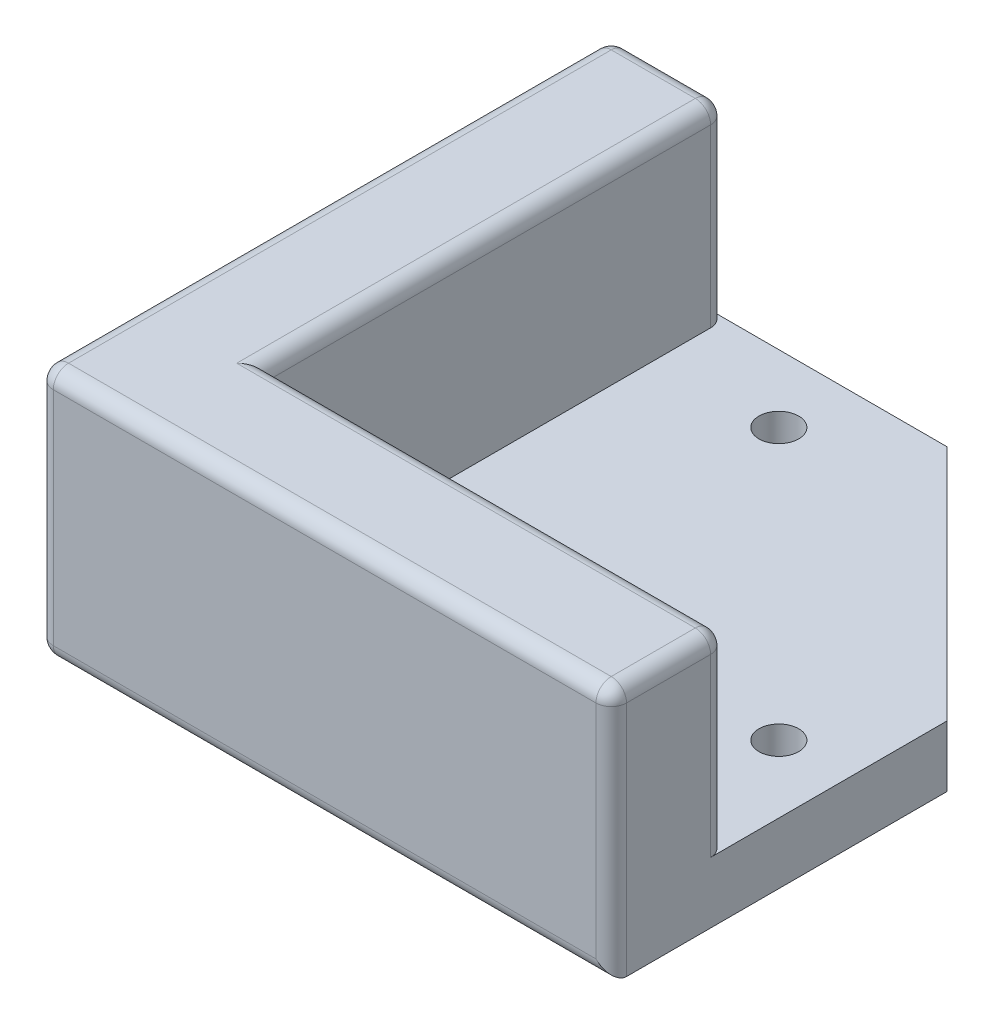
ISO-10303-21;
HEADER;
FILE_DESCRIPTION(('STEP AP214'),'2;1');
FILE_NAME('part.step','',(''),(''),'','','');
FILE_SCHEMA(('AUTOMOTIVE_DESIGN { 1 0 10303 214 1 1 1 1 }'));
ENDSEC;
DATA;
#1=APPLICATION_CONTEXT('core data for automotive mechanical design processes');
#2=APPLICATION_PROTOCOL_DEFINITION('international standard','automotive_design',2000,#1);
#3=PRODUCT_CONTEXT('',#1,'mechanical');
#4=PRODUCT('Part','Part','',(#3));
#5=PRODUCT_RELATED_PRODUCT_CATEGORY('part','',(#4));
#6=PRODUCT_DEFINITION_FORMATION('','',#4);
#7=PRODUCT_DEFINITION_CONTEXT('part definition',#1,'design');
#8=PRODUCT_DEFINITION('design','',#6,#7);
#9=PRODUCT_DEFINITION_SHAPE('','',#8);
#10=(LENGTH_UNIT() NAMED_UNIT(*) SI_UNIT(.MILLI.,.METRE.));
#11=(NAMED_UNIT(*) PLANE_ANGLE_UNIT() SI_UNIT($,.RADIAN.));
#12=(NAMED_UNIT(*) SI_UNIT($,.STERADIAN.) SOLID_ANGLE_UNIT());
#13=UNCERTAINTY_MEASURE_WITH_UNIT(LENGTH_MEASURE(1.E-05),#10,'distance_accuracy_value','');
#14=(GEOMETRIC_REPRESENTATION_CONTEXT(3) GLOBAL_UNCERTAINTY_ASSIGNED_CONTEXT((#13)) GLOBAL_UNIT_ASSIGNED_CONTEXT((#10,
#11,#12)) REPRESENTATION_CONTEXT('',''));
#15=CARTESIAN_POINT('',(0.,0.,0.));
#16=DIRECTION('',(0.,0.,1.));
#17=DIRECTION('',(1.,0.,0.));
#18=AXIS2_PLACEMENT_3D('',#15,#16,#17);
#19=CARTESIAN_POINT('',(38.1,2.54,0.));
#20=DIRECTION('',(-1.,0.,0.));
#21=DIRECTION('',(0.,0.,1.));
#22=AXIS2_PLACEMENT_3D('',#19,#20,#21);
#23=PLANE('',#22);
#24=DIRECTION('',(0.,0.,-1.));
#25=VECTOR('',#24,1.);
#26=CARTESIAN_POINT('',(38.1,1.27,9.525));
#27=LINE('',#26,#25);
#28=CARTESIAN_POINT('',(38.1,1.27,1.27));
#29=VERTEX_POINT('',#28);
#30=CARTESIAN_POINT('',(38.1,1.27,8.255));
#31=VERTEX_POINT('',#30);
#32=EDGE_CURVE('E240',#29,#31,#27,.F.);
#33=ORIENTED_EDGE('',*,*,#32,.T.);
#34=DIRECTION('',(0.,1.,0.));
#35=VECTOR('',#34,1.);
#36=CARTESIAN_POINT('',(38.1,2.54,8.255));
#37=LINE('',#36,#35);
#38=CARTESIAN_POINT('',(38.1,-18.415,8.255));
#39=VERTEX_POINT('',#38);
#40=EDGE_CURVE('E244',#31,#39,#37,.F.);
#41=ORIENTED_EDGE('',*,*,#40,.T.);
#42=DIRECTION('',(0.,0.,1.));
#43=VECTOR('',#42,1.);
#44=CARTESIAN_POINT('',(38.1,-18.415,9.52500000000001));
#45=LINE('',#44,#43);
#46=CARTESIAN_POINT('',(38.1,-18.415,-18.3730790919814));
#47=VERTEX_POINT('',#46);
#48=EDGE_CURVE('E192',#47,#39,#45,.T.);
#49=ORIENTED_EDGE('',*,*,#48,.F.);
#50=DIRECTION('',(0.,1.,0.));
#51=VECTOR('',#50,1.);
#52=CARTESIAN_POINT('',(38.1,-18.415,-18.3730790919814));
#53=LINE('',#52,#51);
#54=CARTESIAN_POINT('',(38.1,-13.335,-18.3730790919814));
#55=VERTEX_POINT('',#54);
#56=EDGE_CURVE('E186',#47,#55,#53,.T.);
#57=ORIENTED_EDGE('',*,*,#56,.T.);
#58=DIRECTION('',(0.,0.,1.));
#59=VECTOR('',#58,1.);
#60=CARTESIAN_POINT('',(38.1,-13.335,9.52500000000001));
#61=LINE('',#60,#59);
#62=CARTESIAN_POINT('',(38.1,-13.335,1.27));
#63=VERTEX_POINT('',#62);
#64=EDGE_CURVE('E175',#55,#63,#61,.T.);
#65=ORIENTED_EDGE('',*,*,#64,.T.);
#66=DIRECTION('',(0.,1.,0.));
#67=VECTOR('',#66,1.);
#68=CARTESIAN_POINT('',(38.1,2.54,1.27));
#69=LINE('',#68,#67);
#70=EDGE_CURVE('E237',#63,#29,#69,.T.);
#71=ORIENTED_EDGE('',*,*,#70,.T.);
#72=EDGE_LOOP('',(#33,#41,#49,#57,#65,#71));
#73=FACE_BOUND('',#72,.T.);
#74=ADVANCED_FACE('F45',(#73),#23,.F.);
#75=CARTESIAN_POINT('',(2.38125,2.54,-38.1));
#76=DIRECTION('',(0.,0.,1.));
#77=DIRECTION('',(1.,0.,0.));
#78=AXIS2_PLACEMENT_3D('',#75,#76,#77);
#79=PLANE('',#78);
#80=DIRECTION('',(1.,0.,0.));
#81=VECTOR('',#80,1.);
#82=CARTESIAN_POINT('',(-9.52499999999999,-18.415,-38.1));
#83=LINE('',#82,#81);
#84=CARTESIAN_POINT('',(-8.255,-18.415,-38.1));
#85=VERTEX_POINT('',#84);
#86=CARTESIAN_POINT('',(18.3730790919813,-18.415,-38.1));
#87=VERTEX_POINT('',#86);
#88=EDGE_CURVE('E163',#85,#87,#83,.T.);
#89=ORIENTED_EDGE('',*,*,#88,.F.);
#90=DIRECTION('',(0.,1.,0.));
#91=VECTOR('',#90,1.);
#92=CARTESIAN_POINT('',(-8.255,2.54,-38.1));
#93=LINE('',#92,#91);
#94=CARTESIAN_POINT('',(-8.255,1.27,-38.1));
#95=VERTEX_POINT('',#94);
#96=EDGE_CURVE('E253',#85,#95,#93,.T.);
#97=ORIENTED_EDGE('',*,*,#96,.T.);
#98=DIRECTION('',(-1.,0.,0.));
#99=VECTOR('',#98,1.);
#100=CARTESIAN_POINT('',(0.,1.27,-38.1));
#101=LINE('',#100,#99);
#102=CARTESIAN_POINT('',(-1.27,1.27,-38.1));
#103=VERTEX_POINT('',#102);
#104=EDGE_CURVE('E250',#95,#103,#101,.F.);
#105=ORIENTED_EDGE('',*,*,#104,.T.);
#106=DIRECTION('',(0.,1.,0.));
#107=VECTOR('',#106,1.);
#108=CARTESIAN_POINT('',(-1.27,2.54,-38.1));
#109=LINE('',#108,#107);
#110=CARTESIAN_POINT('',(-1.27,-13.335,-38.1));
#111=VERTEX_POINT('',#110);
#112=EDGE_CURVE('E247',#103,#111,#109,.F.);
#113=ORIENTED_EDGE('',*,*,#112,.T.);
#114=DIRECTION('',(1.,0.,0.));
#115=VECTOR('',#114,1.);
#116=CARTESIAN_POINT('',(-9.52499999999999,-13.335,-38.1));
#117=LINE('',#116,#115);
#118=CARTESIAN_POINT('',(18.3730790919813,-13.335,-38.1));
#119=VERTEX_POINT('',#118);
#120=EDGE_CURVE('E181',#111,#119,#117,.T.);
#121=ORIENTED_EDGE('',*,*,#120,.T.);
#122=DIRECTION('',(0.,1.,0.));
#123=VECTOR('',#122,1.);
#124=CARTESIAN_POINT('',(18.3730790919813,-18.415,-38.1));
#125=LINE('',#124,#123);
#126=EDGE_CURVE('E178',#87,#119,#125,.T.);
#127=ORIENTED_EDGE('',*,*,#126,.F.);
#128=EDGE_LOOP('',(#89,#97,#105,#113,#121,#127));
#129=FACE_BOUND('',#128,.T.);
#130=ADVANCED_FACE('F179',(#129),#79,.F.);
#131=CARTESIAN_POINT('',(0.,2.54,0.));
#132=DIRECTION('',(0.,1.,0.));
#133=DIRECTION('',(0.,0.,1.));
#134=AXIS2_PLACEMENT_3D('',#131,#132,#133);
#135=PLANE('',#134);
#136=DIRECTION('',(1.,0.,0.));
#137=VECTOR('',#136,1.);
#138=CARTESIAN_POINT('',(0.,2.54,1.27));
#139=LINE('',#138,#137);
#140=CARTESIAN_POINT('',(36.83,2.54,1.27));
#141=VERTEX_POINT('',#140);
#142=CARTESIAN_POINT('',(-1.27,2.54,1.27));
#143=VERTEX_POINT('',#142);
#144=EDGE_CURVE('E231',#141,#143,#139,.F.);
#145=ORIENTED_EDGE('',*,*,#144,.T.);
#146=DIRECTION('',(0.,0.,1.));
#147=VECTOR('',#146,1.);
#148=CARTESIAN_POINT('',(-1.27,2.54,-38.1));
#149=LINE('',#148,#147);
#150=CARTESIAN_POINT('',(-1.27,2.54,-36.83));
#151=VERTEX_POINT('',#150);
#152=EDGE_CURVE('E234',#143,#151,#149,.F.);
#153=ORIENTED_EDGE('',*,*,#152,.T.);
#154=DIRECTION('',(-1.,0.,0.));
#155=VECTOR('',#154,1.);
#156=CARTESIAN_POINT('',(-9.525,2.54,-36.83));
#157=LINE('',#156,#155);
#158=CARTESIAN_POINT('',(-8.255,2.54,-36.83));
#159=VERTEX_POINT('',#158);
#160=EDGE_CURVE('E224',#151,#159,#157,.T.);
#161=ORIENTED_EDGE('',*,*,#160,.T.);
#162=DIRECTION('',(0.,0.,1.));
#163=VECTOR('',#162,1.);
#164=CARTESIAN_POINT('',(-8.255,2.54,0.));
#165=LINE('',#164,#163);
#166=CARTESIAN_POINT('',(-8.25499999999999,2.54,8.255));
#167=VERTEX_POINT('',#166);
#168=EDGE_CURVE('E218',#159,#167,#165,.T.);
#169=ORIENTED_EDGE('',*,*,#168,.T.);
#170=DIRECTION('',(-1.,0.,0.));
#171=VECTOR('',#170,1.);
#172=CARTESIAN_POINT('',(38.1,2.54,8.255));
#173=LINE('',#172,#171);
#174=CARTESIAN_POINT('',(36.83,2.54,8.255));
#175=VERTEX_POINT('',#174);
#176=EDGE_CURVE('E221',#167,#175,#173,.F.);
#177=ORIENTED_EDGE('',*,*,#176,.T.);
#178=DIRECTION('',(0.,0.,-1.));
#179=VECTOR('',#178,1.);
#180=CARTESIAN_POINT('',(36.83,2.54,0.));
#181=LINE('',#180,#179);
#182=EDGE_CURVE('E227',#175,#141,#181,.T.);
#183=ORIENTED_EDGE('',*,*,#182,.T.);
#184=EDGE_LOOP('',(#145,#153,#161,#169,#177,#183));
#185=FACE_BOUND('',#184,.T.);
#186=ADVANCED_FACE('F418',(#185),#135,.T.);
#187=CARTESIAN_POINT('',(0.,-13.335,0.));
#188=DIRECTION('',(-1.,0.,0.));
#189=DIRECTION('',(0.,0.,1.));
#190=AXIS2_PLACEMENT_3D('',#187,#188,#189);
#191=PLANE('',#190);
#192=DIRECTION('',(0.,1.,0.));
#193=VECTOR('',#192,1.);
#194=CARTESIAN_POINT('',(0.,-13.335,-36.83));
#195=LINE('',#194,#193);
#196=CARTESIAN_POINT('',(0.,-13.335,-36.83));
#197=VERTEX_POINT('',#196);
#198=CARTESIAN_POINT('',(0.,1.27,-36.83));
#199=VERTEX_POINT('',#198);
#200=EDGE_CURVE('E256',#197,#199,#195,.T.);
#201=ORIENTED_EDGE('',*,*,#200,.T.);
#202=DIRECTION('',(0.,0.,1.));
#203=VECTOR('',#202,1.);
#204=CARTESIAN_POINT('',(0.,1.27,0.));
#205=LINE('',#204,#203);
#206=CARTESIAN_POINT('',(0.,1.27,0.));
#207=VERTEX_POINT('',#206);
#208=EDGE_CURVE('E259',#199,#207,#205,.T.);
#209=ORIENTED_EDGE('',*,*,#208,.T.);
#210=DIRECTION('',(0.,1.,0.));
#211=VECTOR('',#210,1.);
#212=CARTESIAN_POINT('',(0.,-13.335,0.));
#213=LINE('',#212,#211);
#214=CARTESIAN_POINT('',(0.,-13.335,0.));
#215=VERTEX_POINT('',#214);
#216=EDGE_CURVE('E214',#215,#207,#213,.T.);
#217=ORIENTED_EDGE('',*,*,#216,.F.);
#218=DIRECTION('',(0.,0.,1.));
#219=VECTOR('',#218,1.);
#220=CARTESIAN_POINT('',(0.,-13.335,0.));
#221=LINE('',#220,#219);
#222=EDGE_CURVE('E210',#197,#215,#221,.T.);
#223=ORIENTED_EDGE('',*,*,#222,.F.);
#224=EDGE_LOOP('',(#201,#209,#217,#223));
#225=FACE_BOUND('',#224,.T.);
#226=ADVANCED_FACE('F509',(#225),#191,.F.);
#227=CARTESIAN_POINT('',(0.,-13.335,0.));
#228=DIRECTION('',(0.,0.,-1.));
#229=DIRECTION('',(-1.,0.,0.));
#230=AXIS2_PLACEMENT_3D('',#227,#228,#229);
#231=PLANE('',#230);
#232=ORIENTED_EDGE('',*,*,#216,.T.);
#233=DIRECTION('',(1.,0.,0.));
#234=VECTOR('',#233,1.);
#235=CARTESIAN_POINT('',(0.,1.27,0.));
#236=LINE('',#235,#234);
#237=CARTESIAN_POINT('',(36.83,1.27,0.));
#238=VERTEX_POINT('',#237);
#239=EDGE_CURVE('E265',#207,#238,#236,.T.);
#240=ORIENTED_EDGE('',*,*,#239,.T.);
#241=DIRECTION('',(0.,1.,0.));
#242=VECTOR('',#241,1.);
#243=CARTESIAN_POINT('',(36.83,-13.335,0.));
#244=LINE('',#243,#242);
#245=CARTESIAN_POINT('',(36.83,-13.335,0.));
#246=VERTEX_POINT('',#245);
#247=EDGE_CURVE('E262',#238,#246,#244,.F.);
#248=ORIENTED_EDGE('',*,*,#247,.T.);
#249=DIRECTION('',(-1.,0.,0.));
#250=VECTOR('',#249,1.);
#251=CARTESIAN_POINT('',(0.,-13.335,0.));
#252=LINE('',#251,#250);
#253=EDGE_CURVE('E185',#246,#215,#252,.T.);
#254=ORIENTED_EDGE('',*,*,#253,.T.);
#255=EDGE_LOOP('',(#232,#240,#248,#254));
#256=FACE_BOUND('',#255,.T.);
#257=ADVANCED_FACE('F513',(#256),#231,.T.);
#258=CARTESIAN_POINT('',(0.,-13.335,9.525));
#259=DIRECTION('',(0.,0.,-1.));
#260=DIRECTION('',(-1.,0.,0.));
#261=AXIS2_PLACEMENT_3D('',#258,#259,#260);
#262=PLANE('',#261);
#263=DIRECTION('',(-1.,0.,0.));
#264=VECTOR('',#263,1.);
#265=CARTESIAN_POINT('',(38.1,-17.145,9.525));
#266=LINE('',#265,#264);
#267=CARTESIAN_POINT('',(-8.255,-17.145,9.525));
#268=VERTEX_POINT('',#267);
#269=CARTESIAN_POINT('',(36.83,-17.145,9.525));
#270=VERTEX_POINT('',#269);
#271=EDGE_CURVE('E274',#268,#270,#266,.F.);
#272=ORIENTED_EDGE('',*,*,#271,.T.);
#273=DIRECTION('',(0.,1.,0.));
#274=VECTOR('',#273,1.);
#275=CARTESIAN_POINT('',(36.83,-13.335,9.525));
#276=LINE('',#275,#274);
#277=CARTESIAN_POINT('',(36.83,1.27,9.525));
#278=VERTEX_POINT('',#277);
#279=EDGE_CURVE('E277',#270,#278,#276,.T.);
#280=ORIENTED_EDGE('',*,*,#279,.T.);
#281=DIRECTION('',(-1.,0.,0.));
#282=VECTOR('',#281,1.);
#283=CARTESIAN_POINT('',(-9.52499999999999,1.27,9.525));
#284=LINE('',#283,#282);
#285=CARTESIAN_POINT('',(-8.255,1.27,9.525));
#286=VERTEX_POINT('',#285);
#287=EDGE_CURVE('E271',#278,#286,#284,.T.);
#288=ORIENTED_EDGE('',*,*,#287,.T.);
#289=DIRECTION('',(0.,1.,0.));
#290=VECTOR('',#289,1.);
#291=CARTESIAN_POINT('',(-8.255,-18.415,9.525));
#292=LINE('',#291,#290);
#293=EDGE_CURVE('E268',#286,#268,#292,.F.);
#294=ORIENTED_EDGE('',*,*,#293,.T.);
#295=EDGE_LOOP('',(#272,#280,#288,#294));
#296=FACE_BOUND('',#295,.T.);
#297=ADVANCED_FACE('F536',(#296),#262,.F.);
#298=CARTESIAN_POINT('',(-9.525,-13.335,0.));
#299=DIRECTION('',(-1.,0.,0.));
#300=DIRECTION('',(0.,0.,1.));
#301=AXIS2_PLACEMENT_3D('',#298,#299,#300);
#302=PLANE('',#301);
#303=DIRECTION('',(0.,0.,-1.));
#304=VECTOR('',#303,1.);
#305=CARTESIAN_POINT('',(-9.525,-17.145,0.));
#306=LINE('',#305,#304);
#307=CARTESIAN_POINT('',(-9.525,-17.145,-36.83));
#308=VERTEX_POINT('',#307);
#309=CARTESIAN_POINT('',(-9.525,-17.145,8.255));
#310=VERTEX_POINT('',#309);
#311=EDGE_CURVE('E63',#308,#310,#306,.F.);
#312=ORIENTED_EDGE('',*,*,#311,.T.);
#313=DIRECTION('',(0.,1.,0.));
#314=VECTOR('',#313,1.);
#315=CARTESIAN_POINT('',(-9.525,2.54,8.255));
#316=LINE('',#315,#314);
#317=CARTESIAN_POINT('',(-9.525,1.27,8.255));
#318=VERTEX_POINT('',#317);
#319=EDGE_CURVE('E293',#310,#318,#316,.T.);
#320=ORIENTED_EDGE('',*,*,#319,.T.);
#321=DIRECTION('',(0.,0.,1.));
#322=VECTOR('',#321,1.);
#323=CARTESIAN_POINT('',(-9.525,1.27,0.));
#324=LINE('',#323,#322);
#325=CARTESIAN_POINT('',(-9.525,1.27,-36.83));
#326=VERTEX_POINT('',#325);
#327=EDGE_CURVE('E286',#318,#326,#324,.F.);
#328=ORIENTED_EDGE('',*,*,#327,.T.);
#329=DIRECTION('',(0.,1.,0.));
#330=VECTOR('',#329,1.);
#331=CARTESIAN_POINT('',(-9.525,-18.415,-36.83));
#332=LINE('',#331,#330);
#333=EDGE_CURVE('E68',#326,#308,#332,.F.);
#334=ORIENTED_EDGE('',*,*,#333,.T.);
#335=EDGE_LOOP('',(#312,#320,#328,#334));
#336=FACE_BOUND('',#335,.T.);
#337=ADVANCED_FACE('F542',(#336),#302,.T.);
#338=CARTESIAN_POINT('',(0.,-13.335,0.));
#339=DIRECTION('',(0.,-1.,0.));
#340=DIRECTION('',(0.,0.,-1.));
#341=AXIS2_PLACEMENT_3D('',#338,#339,#340);
#342=PLANE('',#341);
#343=CARTESIAN_POINT('',(10.,-13.335,-32.5));
#344=DIRECTION('',(0.,-1.,0.));
#345=DIRECTION('',(0.,0.,-1.));
#346=AXIS2_PLACEMENT_3D('',#343,#344,#345);
#347=CIRCLE('',#346,1.65);
#348=CARTESIAN_POINT('',(10.,-13.335,-34.15));
#349=VERTEX_POINT('',#348);
#350=EDGE_CURVE('E382',#349,#349,#347,.T.);
#351=ORIENTED_EDGE('',*,*,#350,.T.);
#352=EDGE_LOOP('',(#351));
#353=FACE_BOUND('',#352,.T.);
#354=CARTESIAN_POINT('',(32.5,-13.335,-10.));
#355=DIRECTION('',(0.,-1.,0.));
#356=DIRECTION('',(0.,0.,-1.));
#357=AXIS2_PLACEMENT_3D('',#354,#355,#356);
#358=CIRCLE('',#357,1.65);
#359=CARTESIAN_POINT('',(32.5,-13.335,-11.65));
#360=VERTEX_POINT('',#359);
#361=EDGE_CURVE('E201',#360,#360,#358,.T.);
#362=ORIENTED_EDGE('',*,*,#361,.T.);
#363=EDGE_LOOP('',(#362));
#364=FACE_BOUND('',#363,.T.);
#365=ORIENTED_EDGE('',*,*,#120,.F.);
#366=CARTESIAN_POINT('',(-1.27,-13.335,-36.83));
#367=DIRECTION('',(0.,-1.,0.));
#368=DIRECTION('',(0.,0.,-1.));
#369=AXIS2_PLACEMENT_3D('',#366,#367,#368);
#370=CIRCLE('',#369,1.27);
#371=EDGE_CURVE('E55',#111,#197,#370,.T.);
#372=ORIENTED_EDGE('',*,*,#371,.T.);
#373=ORIENTED_EDGE('',*,*,#222,.T.);
#374=ORIENTED_EDGE('',*,*,#253,.F.);
#375=CARTESIAN_POINT('',(36.83,-13.335,1.27));
#376=DIRECTION('',(0.,-1.,0.));
#377=DIRECTION('',(0.,0.,-1.));
#378=AXIS2_PLACEMENT_3D('',#375,#376,#377);
#379=CIRCLE('',#378,1.27);
#380=EDGE_CURVE('E11',#246,#63,#379,.T.);
#381=ORIENTED_EDGE('',*,*,#380,.T.);
#382=ORIENTED_EDGE('',*,*,#64,.F.);
#383=DIRECTION('',(0.707106781186549,0.,0.707106781186546));
#384=VECTOR('',#383,1.);
#385=CARTESIAN_POINT('',(38.1,-13.335,-18.3730790919814));
#386=LINE('',#385,#384);
#387=EDGE_CURVE('E200',#119,#55,#386,.T.);
#388=ORIENTED_EDGE('',*,*,#387,.F.);
#389=EDGE_LOOP('',(#365,#372,#373,#374,#381,#382,#388));
#390=FACE_BOUND('',#389,.T.);
#391=ADVANCED_FACE('F397',(#353,#364,#390),#342,.F.);
#392=CARTESIAN_POINT('',(38.1,-18.415,-18.3730790919814));
#393=DIRECTION('',(-0.707106781186546,0.,0.707106781186549));
#394=DIRECTION('',(0.707106781186549,0.,0.707106781186546));
#395=AXIS2_PLACEMENT_3D('',#392,#393,#394);
#396=PLANE('',#395);
#397=ORIENTED_EDGE('',*,*,#387,.T.);
#398=ORIENTED_EDGE('',*,*,#56,.F.);
#399=DIRECTION('',(0.707106781186549,0.,0.707106781186546));
#400=VECTOR('',#399,1.);
#401=CARTESIAN_POINT('',(38.1,-18.415,-18.3730790919814));
#402=LINE('',#401,#400);
#403=EDGE_CURVE('E168',#87,#47,#402,.T.);
#404=ORIENTED_EDGE('',*,*,#403,.F.);
#405=ORIENTED_EDGE('',*,*,#126,.T.);
#406=EDGE_LOOP('',(#397,#398,#404,#405));
#407=FACE_BOUND('',#406,.T.);
#408=ADVANCED_FACE('F188',(#407),#396,.F.);
#409=CARTESIAN_POINT('',(0.,-18.415,0.));
#410=DIRECTION('',(0.,-1.,0.));
#411=DIRECTION('',(0.,0.,-1.));
#412=AXIS2_PLACEMENT_3D('',#409,#410,#411);
#413=PLANE('',#412);
#414=CARTESIAN_POINT('',(10.,-18.415,-32.5));
#415=DIRECTION('',(0.,-1.,0.));
#416=DIRECTION('',(0.,0.,-1.));
#417=AXIS2_PLACEMENT_3D('',#414,#415,#416);
#418=CIRCLE('',#417,1.65);
#419=CARTESIAN_POINT('',(10.,-18.415,-34.15));
#420=VERTEX_POINT('',#419);
#421=EDGE_CURVE('E378',#420,#420,#418,.T.);
#422=ORIENTED_EDGE('',*,*,#421,.F.);
#423=EDGE_LOOP('',(#422));
#424=FACE_BOUND('',#423,.T.);
#425=CARTESIAN_POINT('',(32.5,-18.415,-10.));
#426=DIRECTION('',(0.,-1.,0.));
#427=DIRECTION('',(0.,0.,-1.));
#428=AXIS2_PLACEMENT_3D('',#425,#426,#427);
#429=CIRCLE('',#428,1.65);
#430=CARTESIAN_POINT('',(32.5,-18.415,-11.65));
#431=VERTEX_POINT('',#430);
#432=EDGE_CURVE('E388',#431,#431,#429,.T.);
#433=ORIENTED_EDGE('',*,*,#432,.F.);
#434=EDGE_LOOP('',(#433));
#435=FACE_BOUND('',#434,.T.);
#436=ORIENTED_EDGE('',*,*,#48,.T.);
#437=DIRECTION('',(-1.,0.,0.));
#438=VECTOR('',#437,1.);
#439=CARTESIAN_POINT('',(-9.52499999999999,-18.415,8.255));
#440=LINE('',#439,#438);
#441=CARTESIAN_POINT('',(-8.255,-18.415,8.255));
#442=VERTEX_POINT('',#441);
#443=EDGE_CURVE('E283',#39,#442,#440,.T.);
#444=ORIENTED_EDGE('',*,*,#443,.T.);
#445=DIRECTION('',(0.,0.,-1.));
#446=VECTOR('',#445,1.);
#447=CARTESIAN_POINT('',(-8.255,-18.415,0.));
#448=LINE('',#447,#446);
#449=EDGE_CURVE('E171',#442,#85,#448,.T.);
#450=ORIENTED_EDGE('',*,*,#449,.T.);
#451=ORIENTED_EDGE('',*,*,#88,.T.);
#452=ORIENTED_EDGE('',*,*,#403,.T.);
#453=EDGE_LOOP('',(#436,#444,#450,#451,#452));
#454=FACE_BOUND('',#453,.T.);
#455=ADVANCED_FACE('F166',(#424,#435,#454),#413,.T.);
#456=CARTESIAN_POINT('',(32.5,-18.415,-10.));
#457=DIRECTION('',(0.,-1.,0.));
#458=DIRECTION('',(0.,0.,-1.));
#459=AXIS2_PLACEMENT_3D('',#456,#457,#458);
#460=CYLINDRICAL_SURFACE('',#459,1.65);
#461=ORIENTED_EDGE('',*,*,#432,.T.);
#462=EDGE_LOOP('',(#461));
#463=FACE_BOUND('',#462,.T.);
#464=ORIENTED_EDGE('',*,*,#361,.F.);
#465=EDGE_LOOP('',(#464));
#466=FACE_BOUND('',#465,.T.);
#467=ADVANCED_FACE('F400',(#463,#466),#460,.F.);
#468=CARTESIAN_POINT('',(10.,-18.415,-32.5));
#469=DIRECTION('',(0.,-1.,0.));
#470=DIRECTION('',(0.,0.,-1.));
#471=AXIS2_PLACEMENT_3D('',#468,#469,#470);
#472=CYLINDRICAL_SURFACE('',#471,1.65);
#473=ORIENTED_EDGE('',*,*,#421,.T.);
#474=EDGE_LOOP('',(#473));
#475=FACE_BOUND('',#474,.T.);
#476=ORIENTED_EDGE('',*,*,#350,.F.);
#477=EDGE_LOOP('',(#476));
#478=FACE_BOUND('',#477,.T.);
#479=ADVANCED_FACE('F402',(#475,#478),#472,.F.);
#480=CARTESIAN_POINT('',(-8.255,2.54,-36.83));
#481=DIRECTION('',(0.,-1.,0.));
#482=DIRECTION('',(0.,0.,-1.));
#483=AXIS2_PLACEMENT_3D('',#480,#481,#482);
#484=CYLINDRICAL_SURFACE('',#483,1.27);
#485=CARTESIAN_POINT('',(-8.255,1.27,-36.83));
#486=DIRECTION('',(0.,1.,0.));
#487=DIRECTION('',(0.,0.,1.));
#488=AXIS2_PLACEMENT_3D('',#485,#486,#487);
#489=CIRCLE('',#488,1.27);
#490=EDGE_CURVE('E369',#95,#326,#489,.T.);
#491=ORIENTED_EDGE('',*,*,#490,.F.);
#492=ORIENTED_EDGE('',*,*,#96,.F.);
#493=CARTESIAN_POINT('',(-8.255,-17.145,-36.83));
#494=DIRECTION('',(0.,-0.707106781186547,0.707106781186547));
#495=DIRECTION('',(0.,-0.707106781186547,-0.707106781186547));
#496=AXIS2_PLACEMENT_3D('',#493,#494,#495);
#497=ELLIPSE('',#496,1.79605122421383,1.27);
#498=EDGE_CURVE('E49',#308,#85,#497,.T.);
#499=ORIENTED_EDGE('',*,*,#498,.F.);
#500=ORIENTED_EDGE('',*,*,#333,.F.);
#501=EDGE_LOOP('',(#491,#492,#499,#500));
#502=FACE_BOUND('',#501,.T.);
#503=ADVANCED_FACE('F47',(#502),#484,.T.);
#504=CARTESIAN_POINT('',(-8.255,-17.145,0.));
#505=DIRECTION('',(0.,0.,-1.));
#506=DIRECTION('',(-1.,0.,0.));
#507=AXIS2_PLACEMENT_3D('',#504,#505,#506);
#508=CYLINDRICAL_SURFACE('',#507,1.27);
#509=ORIENTED_EDGE('',*,*,#498,.T.);
#510=ORIENTED_EDGE('',*,*,#449,.F.);
#511=CARTESIAN_POINT('',(-8.255,-17.145,8.255));
#512=DIRECTION('',(0.,0.,1.));
#513=DIRECTION('',(1.,0.,0.));
#514=AXIS2_PLACEMENT_3D('',#511,#512,#513);
#515=CIRCLE('',#514,1.27);
#516=EDGE_CURVE('E362',#310,#442,#515,.T.);
#517=ORIENTED_EDGE('',*,*,#516,.F.);
#518=ORIENTED_EDGE('',*,*,#311,.F.);
#519=EDGE_LOOP('',(#509,#510,#517,#518));
#520=FACE_BOUND('',#519,.T.);
#521=ADVANCED_FACE('F488',(#520),#508,.T.);
#522=CARTESIAN_POINT('',(-8.255,1.27,-36.83));
#523=DIRECTION('',(0.,0.,-1.));
#524=DIRECTION('',(-1.,0.,0.));
#525=AXIS2_PLACEMENT_3D('',#522,#523,#524);
#526=SPHERICAL_SURFACE('',#525,1.27);
#527=CARTESIAN_POINT('',(-8.255,1.27,-36.83));
#528=DIRECTION('',(0.,0.,-1.));
#529=DIRECTION('',(-1.,0.,0.));
#530=AXIS2_PLACEMENT_3D('',#527,#528,#529);
#531=CIRCLE('',#530,1.27);
#532=EDGE_CURVE('E354',#159,#326,#531,.F.);
#533=ORIENTED_EDGE('',*,*,#532,.F.);
#534=CARTESIAN_POINT('',(-8.255,1.27,-36.83));
#535=DIRECTION('',(-1.,0.,0.));
#536=DIRECTION('',(0.,0.,1.));
#537=AXIS2_PLACEMENT_3D('',#534,#535,#536);
#538=CIRCLE('',#537,1.27);
#539=EDGE_CURVE('E366',#95,#159,#538,.F.);
#540=ORIENTED_EDGE('',*,*,#539,.F.);
#541=ORIENTED_EDGE('',*,*,#490,.T.);
#542=EDGE_LOOP('',(#533,#540,#541));
#543=FACE_BOUND('',#542,.T.);
#544=ADVANCED_FACE('F485',(#543),#526,.T.);
#545=CARTESIAN_POINT('',(0.,1.27,-36.83));
#546=DIRECTION('',(1.,0.,0.));
#547=DIRECTION('',(0.,0.,-1.));
#548=AXIS2_PLACEMENT_3D('',#545,#546,#547);
#549=CYLINDRICAL_SURFACE('',#548,1.27);
#550=ORIENTED_EDGE('',*,*,#539,.T.);
#551=ORIENTED_EDGE('',*,*,#160,.F.);
#552=CARTESIAN_POINT('',(-1.27,1.27,-36.83));
#553=DIRECTION('',(1.,0.,0.));
#554=DIRECTION('',(0.,0.,-1.));
#555=AXIS2_PLACEMENT_3D('',#552,#553,#554);
#556=CIRCLE('',#555,1.27);
#557=EDGE_CURVE('E350',#103,#151,#556,.T.);
#558=ORIENTED_EDGE('',*,*,#557,.F.);
#559=ORIENTED_EDGE('',*,*,#104,.F.);
#560=EDGE_LOOP('',(#550,#551,#558,#559));
#561=FACE_BOUND('',#560,.T.);
#562=ADVANCED_FACE('F481',(#561),#549,.T.);
#563=CARTESIAN_POINT('',(-1.27,-13.335,-36.83));
#564=DIRECTION('',(0.,1.,0.));
#565=DIRECTION('',(0.,0.,1.));
#566=AXIS2_PLACEMENT_3D('',#563,#564,#565);
#567=CYLINDRICAL_SURFACE('',#566,1.27);
#568=ORIENTED_EDGE('',*,*,#371,.F.);
#569=ORIENTED_EDGE('',*,*,#112,.F.);
#570=CARTESIAN_POINT('',(-1.27,1.27,-36.83));
#571=DIRECTION('',(0.,1.,0.));
#572=DIRECTION('',(0.,0.,1.));
#573=AXIS2_PLACEMENT_3D('',#570,#571,#572);
#574=CIRCLE('',#573,1.27);
#575=EDGE_CURVE('E346',#199,#103,#574,.T.);
#576=ORIENTED_EDGE('',*,*,#575,.F.);
#577=ORIENTED_EDGE('',*,*,#200,.F.);
#578=EDGE_LOOP('',(#568,#569,#576,#577));
#579=FACE_BOUND('',#578,.T.);
#580=ADVANCED_FACE('F477',(#579),#567,.T.);
#581=CARTESIAN_POINT('',(-8.255,-17.145,8.255));
#582=DIRECTION('',(-1.,0.,0.));
#583=DIRECTION('',(0.,0.,1.));
#584=AXIS2_PLACEMENT_3D('',#581,#582,#583);
#585=SPHERICAL_SURFACE('',#584,1.27);
#586=CARTESIAN_POINT('',(-8.255,-17.145,8.255));
#587=DIRECTION('',(-1.,0.,0.));
#588=DIRECTION('',(0.,0.,1.));
#589=AXIS2_PLACEMENT_3D('',#586,#587,#588);
#590=CIRCLE('',#589,1.27);
#591=EDGE_CURVE('E342',#268,#442,#590,.F.);
#592=ORIENTED_EDGE('',*,*,#591,.F.);
#593=CARTESIAN_POINT('',(-8.255,-17.145,8.255));
#594=DIRECTION('',(0.,-1.,0.));
#595=DIRECTION('',(0.,0.,-1.));
#596=AXIS2_PLACEMENT_3D('',#593,#594,#595);
#597=CIRCLE('',#596,1.27);
#598=EDGE_CURVE('E358',#310,#268,#597,.F.);
#599=ORIENTED_EDGE('',*,*,#598,.F.);
#600=ORIENTED_EDGE('',*,*,#516,.T.);
#601=EDGE_LOOP('',(#592,#599,#600));
#602=FACE_BOUND('',#601,.T.);
#603=ADVANCED_FACE('F473',(#602),#585,.T.);
#604=CARTESIAN_POINT('',(-8.255,-13.335,8.255));
#605=DIRECTION('',(0.,-1.,0.));
#606=DIRECTION('',(0.,0.,-1.));
#607=AXIS2_PLACEMENT_3D('',#604,#605,#606);
#608=CYLINDRICAL_SURFACE('',#607,1.27);
#609=ORIENTED_EDGE('',*,*,#598,.T.);
#610=ORIENTED_EDGE('',*,*,#293,.F.);
#611=CARTESIAN_POINT('',(-8.255,1.27,8.255));
#612=DIRECTION('',(0.,1.,0.));
#613=DIRECTION('',(0.,0.,1.));
#614=AXIS2_PLACEMENT_3D('',#611,#612,#613);
#615=CIRCLE('',#614,1.27);
#616=EDGE_CURVE('E338',#318,#286,#615,.T.);
#617=ORIENTED_EDGE('',*,*,#616,.F.);
#618=ORIENTED_EDGE('',*,*,#319,.F.);
#619=EDGE_LOOP('',(#609,#610,#617,#618));
#620=FACE_BOUND('',#619,.T.);
#621=ADVANCED_FACE('F469',(#620),#608,.T.);
#622=CARTESIAN_POINT('',(-8.255,1.27,0.));
#623=DIRECTION('',(0.,0.,1.));
#624=DIRECTION('',(1.,0.,0.));
#625=AXIS2_PLACEMENT_3D('',#622,#623,#624);
#626=CYLINDRICAL_SURFACE('',#625,1.27);
#627=ORIENTED_EDGE('',*,*,#532,.T.);
#628=ORIENTED_EDGE('',*,*,#327,.F.);
#629=CARTESIAN_POINT('',(-8.25499999999999,1.27,8.255));
#630=DIRECTION('',(0.,0.,1.));
#631=DIRECTION('',(1.,0.,0.));
#632=AXIS2_PLACEMENT_3D('',#629,#630,#631);
#633=CIRCLE('',#632,1.27);
#634=EDGE_CURVE('E335',#167,#318,#633,.T.);
#635=ORIENTED_EDGE('',*,*,#634,.F.);
#636=ORIENTED_EDGE('',*,*,#168,.F.);
#637=EDGE_LOOP('',(#627,#628,#635,#636));
#638=FACE_BOUND('',#637,.T.);
#639=ADVANCED_FACE('F465',(#638),#626,.T.);
#640=CARTESIAN_POINT('',(-1.27,1.27,-36.83));
#641=DIRECTION('',(0.,0.,-1.));
#642=DIRECTION('',(-1.,0.,0.));
#643=AXIS2_PLACEMENT_3D('',#640,#641,#642);
#644=SPHERICAL_SURFACE('',#643,1.27);
#645=ORIENTED_EDGE('',*,*,#575,.T.);
#646=ORIENTED_EDGE('',*,*,#557,.T.);
#647=CARTESIAN_POINT('',(-1.27,1.27,-36.83));
#648=DIRECTION('',(0.,0.,-1.));
#649=DIRECTION('',(-1.,0.,0.));
#650=AXIS2_PLACEMENT_3D('',#647,#648,#649);
#651=CIRCLE('',#650,1.27);
#652=EDGE_CURVE('E331',#199,#151,#651,.F.);
#653=ORIENTED_EDGE('',*,*,#652,.F.);
#654=EDGE_LOOP('',(#645,#646,#653));
#655=FACE_BOUND('',#654,.T.);
#656=ADVANCED_FACE('F461',(#655),#644,.T.);
#657=CARTESIAN_POINT('',(0.,-17.145,8.255));
#658=DIRECTION('',(1.,0.,0.));
#659=DIRECTION('',(0.,0.,-1.));
#660=AXIS2_PLACEMENT_3D('',#657,#658,#659);
#661=CYLINDRICAL_SURFACE('',#660,1.27);
#662=ORIENTED_EDGE('',*,*,#591,.T.);
#663=ORIENTED_EDGE('',*,*,#443,.F.);
#664=CARTESIAN_POINT('',(36.83,-17.145,8.255));
#665=DIRECTION('',(0.707106781186547,0.707106781186547,0.));
#666=DIRECTION('',(0.707106781186547,-0.707106781186547,0.));
#667=AXIS2_PLACEMENT_3D('',#664,#665,#666);
#668=ELLIPSE('',#667,1.79605122421383,1.27);
#669=EDGE_CURVE('E327',#270,#39,#668,.T.);
#670=ORIENTED_EDGE('',*,*,#669,.F.);
#671=ORIENTED_EDGE('',*,*,#271,.F.);
#672=EDGE_LOOP('',(#662,#663,#670,#671));
#673=FACE_BOUND('',#672,.T.);
#674=ADVANCED_FACE('F457',(#673),#661,.T.);
#675=CARTESIAN_POINT('',(-8.255,1.27,8.255));
#676=DIRECTION('',(-1.,0.,0.));
#677=DIRECTION('',(0.,0.,1.));
#678=AXIS2_PLACEMENT_3D('',#675,#676,#677);
#679=SPHERICAL_SURFACE('',#678,1.27);
#680=ORIENTED_EDGE('',*,*,#634,.T.);
#681=ORIENTED_EDGE('',*,*,#616,.T.);
#682=CARTESIAN_POINT('',(-8.255,1.27,8.255));
#683=DIRECTION('',(-1.,0.,0.));
#684=DIRECTION('',(0.,-1.,0.));
#685=AXIS2_PLACEMENT_3D('',#682,#683,#684);
#686=CIRCLE('',#685,1.27);
#687=EDGE_CURVE('E323',#167,#286,#686,.F.);
#688=ORIENTED_EDGE('',*,*,#687,.F.);
#689=EDGE_LOOP('',(#680,#681,#688));
#690=FACE_BOUND('',#689,.T.);
#691=ADVANCED_FACE('F453',(#690),#679,.T.);
#692=CARTESIAN_POINT('',(-1.27,1.27,0.));
#693=DIRECTION('',(0.,0.,-1.));
#694=DIRECTION('',(-1.,0.,0.));
#695=AXIS2_PLACEMENT_3D('',#692,#693,#694);
#696=CYLINDRICAL_SURFACE('',#695,1.27);
#697=ORIENTED_EDGE('',*,*,#652,.T.);
#698=ORIENTED_EDGE('',*,*,#152,.F.);
#699=CARTESIAN_POINT('',(-1.27,1.27,1.27));
#700=DIRECTION('',(-0.707106781186547,0.,-0.707106781186547));
#701=DIRECTION('',(0.707106781186547,0.,-0.707106781186547));
#702=AXIS2_PLACEMENT_3D('',#699,#700,#701);
#703=ELLIPSE('',#702,1.79605122421383,1.27);
#704=EDGE_CURVE('E319',#207,#143,#703,.F.);
#705=ORIENTED_EDGE('',*,*,#704,.F.);
#706=ORIENTED_EDGE('',*,*,#208,.F.);
#707=EDGE_LOOP('',(#697,#698,#705,#706));
#708=FACE_BOUND('',#707,.T.);
#709=ADVANCED_FACE('F449',(#708),#696,.T.);
#710=CARTESIAN_POINT('',(36.83,-13.335,8.255));
#711=DIRECTION('',(0.,1.,0.));
#712=DIRECTION('',(0.,0.,1.));
#713=AXIS2_PLACEMENT_3D('',#710,#711,#712);
#714=CYLINDRICAL_SURFACE('',#713,1.27);
#715=ORIENTED_EDGE('',*,*,#669,.T.);
#716=ORIENTED_EDGE('',*,*,#40,.F.);
#717=CARTESIAN_POINT('',(36.83,1.27,8.255));
#718=DIRECTION('',(0.,1.,0.));
#719=DIRECTION('',(-1.,0.,0.));
#720=AXIS2_PLACEMENT_3D('',#717,#718,#719);
#721=CIRCLE('',#720,1.27);
#722=EDGE_CURVE('E315',#278,#31,#721,.T.);
#723=ORIENTED_EDGE('',*,*,#722,.F.);
#724=ORIENTED_EDGE('',*,*,#279,.F.);
#725=EDGE_LOOP('',(#715,#716,#723,#724));
#726=FACE_BOUND('',#725,.T.);
#727=ADVANCED_FACE('F445',(#726),#714,.T.);
#728=CARTESIAN_POINT('',(0.,1.27,8.255));
#729=DIRECTION('',(1.,0.,0.));
#730=DIRECTION('',(0.,0.,-1.));
#731=AXIS2_PLACEMENT_3D('',#728,#729,#730);
#732=CYLINDRICAL_SURFACE('',#731,1.27);
#733=ORIENTED_EDGE('',*,*,#687,.T.);
#734=ORIENTED_EDGE('',*,*,#287,.F.);
#735=CARTESIAN_POINT('',(36.83,1.27,8.255));
#736=DIRECTION('',(1.,0.,0.));
#737=DIRECTION('',(0.,0.,-1.));
#738=AXIS2_PLACEMENT_3D('',#735,#736,#737);
#739=CIRCLE('',#738,1.27);
#740=EDGE_CURVE('E312',#175,#278,#739,.T.);
#741=ORIENTED_EDGE('',*,*,#740,.F.);
#742=ORIENTED_EDGE('',*,*,#176,.F.);
#743=EDGE_LOOP('',(#733,#734,#741,#742));
#744=FACE_BOUND('',#743,.T.);
#745=ADVANCED_FACE('F441',(#744),#732,.T.);
#746=CARTESIAN_POINT('',(0.,1.27,1.27));
#747=DIRECTION('',(1.,0.,0.));
#748=DIRECTION('',(0.,0.,-1.));
#749=AXIS2_PLACEMENT_3D('',#746,#747,#748);
#750=CYLINDRICAL_SURFACE('',#749,1.27);
#751=ORIENTED_EDGE('',*,*,#704,.T.);
#752=ORIENTED_EDGE('',*,*,#144,.F.);
#753=CARTESIAN_POINT('',(36.83,1.27,1.27));
#754=DIRECTION('',(1.,0.,0.));
#755=DIRECTION('',(0.,0.,-1.));
#756=AXIS2_PLACEMENT_3D('',#753,#754,#755);
#757=CIRCLE('',#756,1.27);
#758=EDGE_CURVE('E308',#238,#141,#757,.T.);
#759=ORIENTED_EDGE('',*,*,#758,.F.);
#760=ORIENTED_EDGE('',*,*,#239,.F.);
#761=EDGE_LOOP('',(#751,#752,#759,#760));
#762=FACE_BOUND('',#761,.T.);
#763=ADVANCED_FACE('F437',(#762),#750,.T.);
#764=CARTESIAN_POINT('',(36.83,2.54,1.27));
#765=DIRECTION('',(0.,-1.,0.));
#766=DIRECTION('',(0.,0.,-1.));
#767=AXIS2_PLACEMENT_3D('',#764,#765,#766);
#768=CYLINDRICAL_SURFACE('',#767,1.27);
#769=ORIENTED_EDGE('',*,*,#380,.F.);
#770=ORIENTED_EDGE('',*,*,#247,.F.);
#771=CARTESIAN_POINT('',(36.83,1.27,1.27));
#772=DIRECTION('',(0.,1.,0.));
#773=DIRECTION('',(0.,0.,1.));
#774=AXIS2_PLACEMENT_3D('',#771,#772,#773);
#775=CIRCLE('',#774,1.27);
#776=EDGE_CURVE('E304',#29,#238,#775,.T.);
#777=ORIENTED_EDGE('',*,*,#776,.F.);
#778=ORIENTED_EDGE('',*,*,#70,.F.);
#779=EDGE_LOOP('',(#769,#770,#777,#778));
#780=FACE_BOUND('',#779,.T.);
#781=ADVANCED_FACE('F433',(#780),#768,.T.);
#782=CARTESIAN_POINT('',(36.83,1.27,8.255));
#783=DIRECTION('',(0.,0.,1.));
#784=DIRECTION('',(0.,-1.,0.));
#785=AXIS2_PLACEMENT_3D('',#782,#783,#784);
#786=SPHERICAL_SURFACE('',#785,1.27);
#787=ORIENTED_EDGE('',*,*,#740,.T.);
#788=ORIENTED_EDGE('',*,*,#722,.T.);
#789=CARTESIAN_POINT('',(36.83,1.27,8.255));
#790=DIRECTION('',(0.,0.,1.));
#791=DIRECTION('',(1.,0.,0.));
#792=AXIS2_PLACEMENT_3D('',#789,#790,#791);
#793=CIRCLE('',#792,1.27);
#794=EDGE_CURVE('E301',#175,#31,#793,.F.);
#795=ORIENTED_EDGE('',*,*,#794,.F.);
#796=EDGE_LOOP('',(#787,#788,#795));
#797=FACE_BOUND('',#796,.T.);
#798=ADVANCED_FACE('F429',(#797),#786,.T.);
#799=CARTESIAN_POINT('',(36.83,1.27,1.27));
#800=DIRECTION('',(0.,0.,-1.));
#801=DIRECTION('',(0.,1.,0.));
#802=AXIS2_PLACEMENT_3D('',#799,#800,#801);
#803=SPHERICAL_SURFACE('',#802,1.27);
#804=ORIENTED_EDGE('',*,*,#776,.T.);
#805=ORIENTED_EDGE('',*,*,#758,.T.);
#806=CARTESIAN_POINT('',(36.83,1.27,1.27));
#807=DIRECTION('',(0.,0.,-1.));
#808=DIRECTION('',(-1.,0.,0.));
#809=AXIS2_PLACEMENT_3D('',#806,#807,#808);
#810=CIRCLE('',#809,1.27);
#811=EDGE_CURVE('E298',#29,#141,#810,.F.);
#812=ORIENTED_EDGE('',*,*,#811,.F.);
#813=EDGE_LOOP('',(#804,#805,#812));
#814=FACE_BOUND('',#813,.T.);
#815=ADVANCED_FACE('F425',(#814),#803,.T.);
#816=CARTESIAN_POINT('',(36.83,1.27,0.));
#817=DIRECTION('',(0.,0.,1.));
#818=DIRECTION('',(1.,0.,0.));
#819=AXIS2_PLACEMENT_3D('',#816,#817,#818);
#820=CYLINDRICAL_SURFACE('',#819,1.27);
#821=ORIENTED_EDGE('',*,*,#794,.T.);
#822=ORIENTED_EDGE('',*,*,#32,.F.);
#823=ORIENTED_EDGE('',*,*,#811,.T.);
#824=ORIENTED_EDGE('',*,*,#182,.F.);
#825=EDGE_LOOP('',(#821,#822,#823,#824));
#826=FACE_BOUND('',#825,.T.);
#827=ADVANCED_FACE('F422',(#826),#820,.T.);
#828=CLOSED_SHELL('',(#74,#130,#186,#226,#257,#297,#337,#391,#408,#455,#467,#479,#503,#521,#544,
#562,#580,#603,#621,#639,#656,#674,#691,#709,#727,#745,#763,#781,#798,#815,#827));
#829=MANIFOLD_SOLID_BREP('B2',#828);
#830=ADVANCED_BREP_SHAPE_REPRESENTATION('',(#18,#829),#14);
#831=SHAPE_DEFINITION_REPRESENTATION(#9,#830);
ENDSEC;
END-ISO-10303-21;
